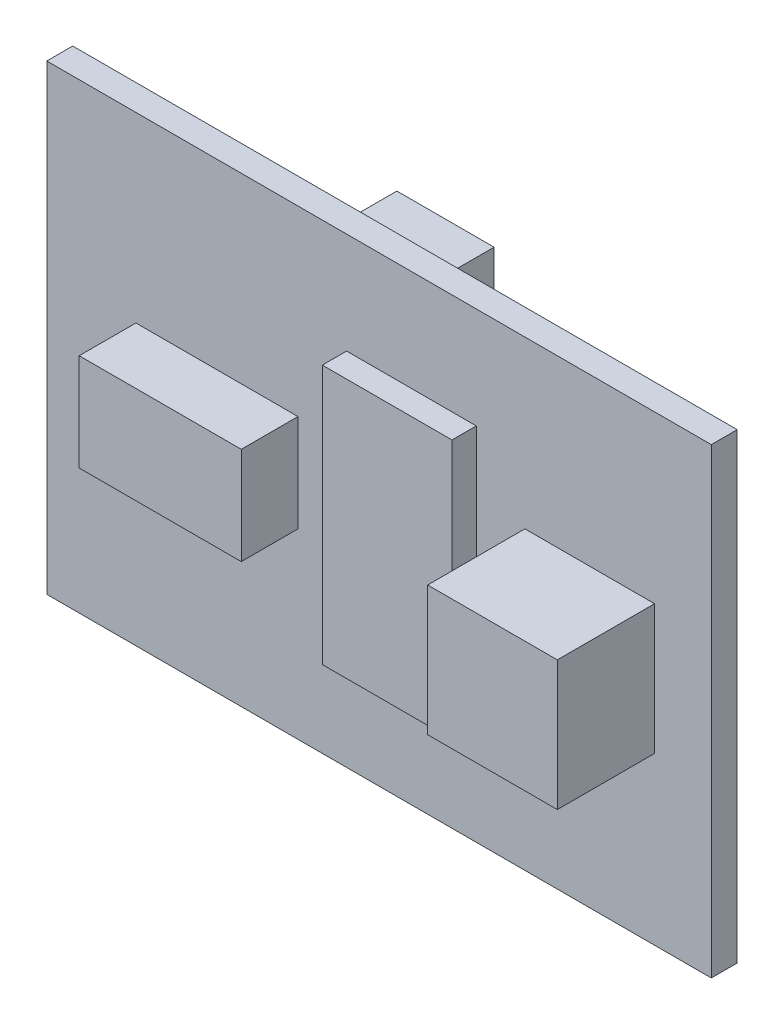
ISO-10303-21;
HEADER;
FILE_DESCRIPTION(('STEP AP214'),'2;1');
FILE_NAME('part.step','',(''),(''),'','','');
FILE_SCHEMA(('AUTOMOTIVE_DESIGN { 1 0 10303 214 1 1 1 1 }'));
ENDSEC;
DATA;
#1=APPLICATION_CONTEXT('core data for automotive mechanical design processes');
#2=APPLICATION_PROTOCOL_DEFINITION('international standard','automotive_design',2000,#1);
#3=PRODUCT_CONTEXT('',#1,'mechanical');
#4=PRODUCT('Part','Part','',(#3));
#5=PRODUCT_RELATED_PRODUCT_CATEGORY('part','',(#4));
#6=PRODUCT_DEFINITION_FORMATION('','',#4);
#7=PRODUCT_DEFINITION_CONTEXT('part definition',#1,'design');
#8=PRODUCT_DEFINITION('design','',#6,#7);
#9=PRODUCT_DEFINITION_SHAPE('','',#8);
#10=(LENGTH_UNIT() NAMED_UNIT(*) SI_UNIT(.MILLI.,.METRE.));
#11=(NAMED_UNIT(*) PLANE_ANGLE_UNIT() SI_UNIT($,.RADIAN.));
#12=(NAMED_UNIT(*) SI_UNIT($,.STERADIAN.) SOLID_ANGLE_UNIT());
#13=UNCERTAINTY_MEASURE_WITH_UNIT(LENGTH_MEASURE(1.E-05),#10,'distance_accuracy_value','');
#14=(GEOMETRIC_REPRESENTATION_CONTEXT(3) GLOBAL_UNCERTAINTY_ASSIGNED_CONTEXT((#13)) GLOBAL_UNIT_ASSIGNED_CONTEXT((#10,
#11,#12)) REPRESENTATION_CONTEXT('',''));
#15=CARTESIAN_POINT('',(0.,0.,0.));
#16=DIRECTION('',(0.,0.,1.));
#17=DIRECTION('',(1.,0.,0.));
#18=AXIS2_PLACEMENT_3D('',#15,#16,#17);
#19=CARTESIAN_POINT('',(0.,0.,14.7));
#20=DIRECTION('',(0.,0.,-1.));
#21=DIRECTION('',(-1.,0.,0.));
#22=AXIS2_PLACEMENT_3D('',#19,#20,#21);
#23=PLANE('',#22);
#24=DIRECTION('',(0.,1.,0.));
#25=VECTOR('',#24,1.);
#26=CARTESIAN_POINT('',(-15.,0.5,14.7));
#27=LINE('',#26,#25);
#28=CARTESIAN_POINT('',(-15.,0.5,14.7));
#29=VERTEX_POINT('',#28);
#30=CARTESIAN_POINT('',(-15.,6.5,14.7));
#31=VERTEX_POINT('',#30);
#32=EDGE_CURVE('E197',#29,#31,#27,.T.);
#33=ORIENTED_EDGE('',*,*,#32,.F.);
#34=DIRECTION('',(1.,0.,0.));
#35=VECTOR('',#34,1.);
#36=CARTESIAN_POINT('',(-25.,0.5,14.7));
#37=LINE('',#36,#35);
#38=CARTESIAN_POINT('',(-25.,0.5,14.7));
#39=VERTEX_POINT('',#38);
#40=EDGE_CURVE('E210',#39,#29,#37,.T.);
#41=ORIENTED_EDGE('',*,*,#40,.F.);
#42=DIRECTION('',(0.,-1.,0.));
#43=VECTOR('',#42,1.);
#44=CARTESIAN_POINT('',(-25.,0.5,14.7));
#45=LINE('',#44,#43);
#46=CARTESIAN_POINT('',(-25.,6.5,14.7));
#47=VERTEX_POINT('',#46);
#48=EDGE_CURVE('E219',#47,#39,#45,.T.);
#49=ORIENTED_EDGE('',*,*,#48,.F.);
#50=DIRECTION('',(-1.,0.,0.));
#51=VECTOR('',#50,1.);
#52=CARTESIAN_POINT('',(-25.,6.5,14.7));
#53=LINE('',#52,#51);
#54=EDGE_CURVE('E200',#31,#47,#53,.T.);
#55=ORIENTED_EDGE('',*,*,#54,.F.);
#56=EDGE_LOOP('',(#33,#41,#49,#55));
#57=FACE_BOUND('',#56,.T.);
#58=DIRECTION('',(0.,1.,0.));
#59=VECTOR('',#58,1.);
#60=CARTESIAN_POINT('',(10.5,-10.75,14.7));
#61=LINE('',#60,#59);
#62=CARTESIAN_POINT('',(10.5,-10.75,14.7));
#63=VERTEX_POINT('',#62);
#64=CARTESIAN_POINT('',(10.5,17.75,14.7));
#65=VERTEX_POINT('',#64);
#66=EDGE_CURVE('E302',#63,#65,#61,.T.);
#67=ORIENTED_EDGE('',*,*,#66,.T.);
#68=DIRECTION('',(-1.,0.,0.));
#69=VECTOR('',#68,1.);
#70=CARTESIAN_POINT('',(-30.5,17.75,14.7));
#71=LINE('',#70,#69);
#72=CARTESIAN_POINT('',(-30.5,17.75,14.7));
#73=VERTEX_POINT('',#72);
#74=EDGE_CURVE('E305',#65,#73,#71,.T.);
#75=ORIENTED_EDGE('',*,*,#74,.T.);
#76=DIRECTION('',(0.,-1.,0.));
#77=VECTOR('',#76,1.);
#78=CARTESIAN_POINT('',(-30.5,-10.75,14.7));
#79=LINE('',#78,#77);
#80=CARTESIAN_POINT('',(-30.5,-10.75,14.7));
#81=VERTEX_POINT('',#80);
#82=EDGE_CURVE('E308',#73,#81,#79,.T.);
#83=ORIENTED_EDGE('',*,*,#82,.T.);
#84=DIRECTION('',(1.,0.,0.));
#85=VECTOR('',#84,1.);
#86=CARTESIAN_POINT('',(-30.5,-10.75,14.7));
#87=LINE('',#86,#85);
#88=EDGE_CURVE('E310',#81,#63,#87,.T.);
#89=ORIENTED_EDGE('',*,*,#88,.T.);
#90=EDGE_LOOP('',(#67,#75,#83,#89));
#91=FACE_BOUND('',#90,.T.);
#92=DIRECTION('',(0.,1.,0.));
#93=VECTOR('',#92,1.);
#94=CARTESIAN_POINT('',(7.,-0.5,14.7));
#95=LINE('',#94,#93);
#96=CARTESIAN_POINT('',(7.,-0.5,14.7));
#97=VERTEX_POINT('',#96);
#98=CARTESIAN_POINT('',(7.,7.5,14.7));
#99=VERTEX_POINT('',#98);
#100=EDGE_CURVE('E235',#97,#99,#95,.T.);
#101=ORIENTED_EDGE('',*,*,#100,.F.);
#102=DIRECTION('',(1.,0.,0.));
#103=VECTOR('',#102,1.);
#104=CARTESIAN_POINT('',(-1.,-0.5,14.7));
#105=LINE('',#104,#103);
#106=CARTESIAN_POINT('',(-1.,-0.5,14.7));
#107=VERTEX_POINT('',#106);
#108=EDGE_CURVE('E240',#107,#97,#105,.T.);
#109=ORIENTED_EDGE('',*,*,#108,.F.);
#110=DIRECTION('',(0.,-1.,0.));
#111=VECTOR('',#110,1.);
#112=CARTESIAN_POINT('',(-1.,-0.5,14.7));
#113=LINE('',#112,#111);
#114=CARTESIAN_POINT('',(-1.,7.5,14.7));
#115=VERTEX_POINT('',#114);
#116=EDGE_CURVE('E252',#115,#107,#113,.T.);
#117=ORIENTED_EDGE('',*,*,#116,.F.);
#118=DIRECTION('',(-1.,0.,0.));
#119=VECTOR('',#118,1.);
#120=CARTESIAN_POINT('',(-1.,7.5,14.7));
#121=LINE('',#120,#119);
#122=EDGE_CURVE('E249',#99,#115,#121,.T.);
#123=ORIENTED_EDGE('',*,*,#122,.F.);
#124=EDGE_LOOP('',(#101,#109,#117,#123));
#125=FACE_BOUND('',#124,.T.);
#126=DIRECTION('',(0.,1.,0.));
#127=VECTOR('',#126,1.);
#128=CARTESIAN_POINT('',(-4.,-4.5,14.7));
#129=LINE('',#128,#127);
#130=CARTESIAN_POINT('',(-4.,-4.5,14.7));
#131=VERTEX_POINT('',#130);
#132=CARTESIAN_POINT('',(-4.,11.5,14.7));
#133=VERTEX_POINT('',#132);
#134=EDGE_CURVE('E196',#131,#133,#129,.T.);
#135=ORIENTED_EDGE('',*,*,#134,.F.);
#136=DIRECTION('',(1.,0.,0.));
#137=VECTOR('',#136,1.);
#138=CARTESIAN_POINT('',(-12.,-4.5,14.7));
#139=LINE('',#138,#137);
#140=CARTESIAN_POINT('',(-12.,-4.5,14.7));
#141=VERTEX_POINT('',#140);
#142=EDGE_CURVE('E193',#141,#131,#139,.T.);
#143=ORIENTED_EDGE('',*,*,#142,.F.);
#144=DIRECTION('',(0.,-1.,0.));
#145=VECTOR('',#144,1.);
#146=CARTESIAN_POINT('',(-12.,-4.5,14.7));
#147=LINE('',#146,#145);
#148=CARTESIAN_POINT('',(-12.,11.5,14.7));
#149=VERTEX_POINT('',#148);
#150=EDGE_CURVE('E59',#149,#141,#147,.T.);
#151=ORIENTED_EDGE('',*,*,#150,.F.);
#152=DIRECTION('',(-1.,0.,0.));
#153=VECTOR('',#152,1.);
#154=CARTESIAN_POINT('',(-12.,11.5,14.7));
#155=LINE('',#154,#153);
#156=EDGE_CURVE('E54',#133,#149,#155,.T.);
#157=ORIENTED_EDGE('',*,*,#156,.F.);
#158=EDGE_LOOP('',(#135,#143,#151,#157));
#159=FACE_BOUND('',#158,.T.);
#160=ADVANCED_FACE('F39',(#57,#91,#125,#159),#23,.F.);
#161=CARTESIAN_POINT('',(0.,0.,13.1));
#162=DIRECTION('',(0.,0.,-1.));
#163=DIRECTION('',(-1.,0.,0.));
#164=AXIS2_PLACEMENT_3D('',#161,#162,#163);
#165=PLANE('',#164);
#166=DIRECTION('',(0.,1.,0.));
#167=VECTOR('',#166,1.);
#168=CARTESIAN_POINT('',(10.5,-10.75,13.1));
#169=LINE('',#168,#167);
#170=CARTESIAN_POINT('',(10.5,-10.75,13.1));
#171=VERTEX_POINT('',#170);
#172=CARTESIAN_POINT('',(10.5,17.75,13.1));
#173=VERTEX_POINT('',#172);
#174=EDGE_CURVE('E301',#171,#173,#169,.T.);
#175=ORIENTED_EDGE('',*,*,#174,.F.);
#176=DIRECTION('',(1.,0.,0.));
#177=VECTOR('',#176,1.);
#178=CARTESIAN_POINT('',(-30.5,-10.75,13.1));
#179=LINE('',#178,#177);
#180=CARTESIAN_POINT('',(-30.5,-10.75,13.1));
#181=VERTEX_POINT('',#180);
#182=EDGE_CURVE('E306',#181,#171,#179,.T.);
#183=ORIENTED_EDGE('',*,*,#182,.F.);
#184=DIRECTION('',(0.,-1.,0.));
#185=VECTOR('',#184,1.);
#186=CARTESIAN_POINT('',(-30.5,-10.75,13.1));
#187=LINE('',#186,#185);
#188=CARTESIAN_POINT('',(-30.5,17.75,13.1));
#189=VERTEX_POINT('',#188);
#190=EDGE_CURVE('E317',#189,#181,#187,.T.);
#191=ORIENTED_EDGE('',*,*,#190,.F.);
#192=DIRECTION('',(-1.,0.,0.));
#193=VECTOR('',#192,1.);
#194=CARTESIAN_POINT('',(-30.5,17.75,13.1));
#195=LINE('',#194,#193);
#196=EDGE_CURVE('E315',#173,#189,#195,.T.);
#197=ORIENTED_EDGE('',*,*,#196,.F.);
#198=EDGE_LOOP('',(#175,#183,#191,#197));
#199=FACE_BOUND('',#198,.T.);
#200=DIRECTION('',(1.,0.,0.));
#201=VECTOR('',#200,1.);
#202=CARTESIAN_POINT('',(-13.,-10.5,13.1));
#203=LINE('',#202,#201);
#204=CARTESIAN_POINT('',(-13.,-10.5,13.1));
#205=VERTEX_POINT('',#204);
#206=CARTESIAN_POINT('',(-7.,-10.5,13.1));
#207=VERTEX_POINT('',#206);
#208=EDGE_CURVE('E279',#205,#207,#203,.T.);
#209=ORIENTED_EDGE('',*,*,#208,.T.);
#210=DIRECTION('',(0.,1.,0.));
#211=VECTOR('',#210,1.);
#212=CARTESIAN_POINT('',(-7.,-10.5,13.1));
#213=LINE('',#212,#211);
#214=CARTESIAN_POINT('',(-7.,17.5,13.1));
#215=VERTEX_POINT('',#214);
#216=EDGE_CURVE('E269',#207,#215,#213,.T.);
#217=ORIENTED_EDGE('',*,*,#216,.T.);
#218=DIRECTION('',(-1.,0.,0.));
#219=VECTOR('',#218,1.);
#220=CARTESIAN_POINT('',(-13.,17.5,13.1));
#221=LINE('',#220,#219);
#222=CARTESIAN_POINT('',(-13.,17.5,13.1));
#223=VERTEX_POINT('',#222);
#224=EDGE_CURVE('E272',#215,#223,#221,.T.);
#225=ORIENTED_EDGE('',*,*,#224,.T.);
#226=DIRECTION('',(0.,-1.,0.));
#227=VECTOR('',#226,1.);
#228=CARTESIAN_POINT('',(-13.,-10.5,13.1));
#229=LINE('',#228,#227);
#230=EDGE_CURVE('E276',#223,#205,#229,.T.);
#231=ORIENTED_EDGE('',*,*,#230,.T.);
#232=EDGE_LOOP('',(#209,#217,#225,#231));
#233=FACE_BOUND('',#232,.T.);
#234=ADVANCED_FACE('F335',(#199,#233),#165,.T.);
#235=CARTESIAN_POINT('',(10.5,-10.75,14.7));
#236=DIRECTION('',(-1.,0.,0.));
#237=DIRECTION('',(0.,0.,1.));
#238=AXIS2_PLACEMENT_3D('',#235,#236,#237);
#239=PLANE('',#238);
#240=ORIENTED_EDGE('',*,*,#174,.T.);
#241=DIRECTION('',(0.,0.,-1.));
#242=VECTOR('',#241,1.);
#243=CARTESIAN_POINT('',(10.5,17.75,14.7));
#244=LINE('',#243,#242);
#245=EDGE_CURVE('E11',#65,#173,#244,.T.);
#246=ORIENTED_EDGE('',*,*,#245,.F.);
#247=ORIENTED_EDGE('',*,*,#66,.F.);
#248=DIRECTION('',(0.,0.,-1.));
#249=VECTOR('',#248,1.);
#250=CARTESIAN_POINT('',(10.5,-10.75,14.7));
#251=LINE('',#250,#249);
#252=EDGE_CURVE('E312',#63,#171,#251,.T.);
#253=ORIENTED_EDGE('',*,*,#252,.T.);
#254=EDGE_LOOP('',(#240,#246,#247,#253));
#255=FACE_BOUND('',#254,.T.);
#256=ADVANCED_FACE('F41',(#255),#239,.F.);
#257=CARTESIAN_POINT('',(-30.5,17.75,14.7));
#258=DIRECTION('',(0.,-1.,0.));
#259=DIRECTION('',(0.,0.,-1.));
#260=AXIS2_PLACEMENT_3D('',#257,#258,#259);
#261=PLANE('',#260);
#262=ORIENTED_EDGE('',*,*,#196,.T.);
#263=DIRECTION('',(0.,0.,-1.));
#264=VECTOR('',#263,1.);
#265=CARTESIAN_POINT('',(-30.5,17.75,14.7));
#266=LINE('',#265,#264);
#267=EDGE_CURVE('E47',#73,#189,#266,.T.);
#268=ORIENTED_EDGE('',*,*,#267,.F.);
#269=ORIENTED_EDGE('',*,*,#74,.F.);
#270=ORIENTED_EDGE('',*,*,#245,.T.);
#271=EDGE_LOOP('',(#262,#268,#269,#270));
#272=FACE_BOUND('',#271,.T.);
#273=ADVANCED_FACE('F346',(#272),#261,.F.);
#274=CARTESIAN_POINT('',(-30.5,-10.75,14.7));
#275=DIRECTION('',(1.,0.,0.));
#276=DIRECTION('',(0.,0.,-1.));
#277=AXIS2_PLACEMENT_3D('',#274,#275,#276);
#278=PLANE('',#277);
#279=ORIENTED_EDGE('',*,*,#190,.T.);
#280=DIRECTION('',(0.,0.,-1.));
#281=VECTOR('',#280,1.);
#282=CARTESIAN_POINT('',(-30.5,-10.75,14.7));
#283=LINE('',#282,#281);
#284=EDGE_CURVE('E322',#81,#181,#283,.T.);
#285=ORIENTED_EDGE('',*,*,#284,.F.);
#286=ORIENTED_EDGE('',*,*,#82,.F.);
#287=ORIENTED_EDGE('',*,*,#267,.T.);
#288=EDGE_LOOP('',(#279,#285,#286,#287));
#289=FACE_BOUND('',#288,.T.);
#290=ADVANCED_FACE('F329',(#289),#278,.F.);
#291=CARTESIAN_POINT('',(-30.5,-10.75,14.7));
#292=DIRECTION('',(0.,1.,0.));
#293=DIRECTION('',(0.,0.,1.));
#294=AXIS2_PLACEMENT_3D('',#291,#292,#293);
#295=PLANE('',#294);
#296=ORIENTED_EDGE('',*,*,#182,.T.);
#297=ORIENTED_EDGE('',*,*,#252,.F.);
#298=ORIENTED_EDGE('',*,*,#88,.F.);
#299=ORIENTED_EDGE('',*,*,#284,.T.);
#300=EDGE_LOOP('',(#296,#297,#298,#299));
#301=FACE_BOUND('',#300,.T.);
#302=ADVANCED_FACE('F339',(#301),#295,.F.);
#303=CARTESIAN_POINT('',(-7.,-10.5,13.1));
#304=DIRECTION('',(-1.,0.,0.));
#305=DIRECTION('',(0.,0.,1.));
#306=AXIS2_PLACEMENT_3D('',#303,#304,#305);
#307=PLANE('',#306);
#308=DIRECTION('',(0.,1.,0.));
#309=VECTOR('',#308,1.);
#310=CARTESIAN_POINT('',(-7.,-10.5,10.6));
#311=LINE('',#310,#309);
#312=CARTESIAN_POINT('',(-7.,-10.5,10.6));
#313=VERTEX_POINT('',#312);
#314=CARTESIAN_POINT('',(-7.,17.5,10.6));
#315=VERTEX_POINT('',#314);
#316=EDGE_CURVE('E268',#313,#315,#311,.T.);
#317=ORIENTED_EDGE('',*,*,#316,.T.);
#318=DIRECTION('',(0.,0.,-1.));
#319=VECTOR('',#318,1.);
#320=CARTESIAN_POINT('',(-7.,17.5,13.1));
#321=LINE('',#320,#319);
#322=EDGE_CURVE('E298',#215,#315,#321,.T.);
#323=ORIENTED_EDGE('',*,*,#322,.F.);
#324=ORIENTED_EDGE('',*,*,#216,.F.);
#325=DIRECTION('',(0.,0.,-1.));
#326=VECTOR('',#325,1.);
#327=CARTESIAN_POINT('',(-7.,-10.5,13.1));
#328=LINE('',#327,#326);
#329=EDGE_CURVE('E282',#207,#313,#328,.T.);
#330=ORIENTED_EDGE('',*,*,#329,.T.);
#331=EDGE_LOOP('',(#317,#323,#324,#330));
#332=FACE_BOUND('',#331,.T.);
#333=ADVANCED_FACE('F361',(#332),#307,.F.);
#334=CARTESIAN_POINT('',(-13.,17.5,13.1));
#335=DIRECTION('',(0.,-1.,0.));
#336=DIRECTION('',(0.,0.,-1.));
#337=AXIS2_PLACEMENT_3D('',#334,#335,#336);
#338=PLANE('',#337);
#339=DIRECTION('',(-1.,0.,0.));
#340=VECTOR('',#339,1.);
#341=CARTESIAN_POINT('',(-13.,17.5,10.6));
#342=LINE('',#341,#340);
#343=CARTESIAN_POINT('',(-13.,17.5,10.6));
#344=VERTEX_POINT('',#343);
#345=EDGE_CURVE('E285',#315,#344,#342,.T.);
#346=ORIENTED_EDGE('',*,*,#345,.T.);
#347=DIRECTION('',(0.,0.,-1.));
#348=VECTOR('',#347,1.);
#349=CARTESIAN_POINT('',(-13.,17.5,13.1));
#350=LINE('',#349,#348);
#351=EDGE_CURVE('E295',#223,#344,#350,.T.);
#352=ORIENTED_EDGE('',*,*,#351,.F.);
#353=ORIENTED_EDGE('',*,*,#224,.F.);
#354=ORIENTED_EDGE('',*,*,#322,.T.);
#355=EDGE_LOOP('',(#346,#352,#353,#354));
#356=FACE_BOUND('',#355,.T.);
#357=ADVANCED_FACE('F368',(#356),#338,.F.);
#358=CARTESIAN_POINT('',(-13.,-10.5,13.1));
#359=DIRECTION('',(1.,0.,0.));
#360=DIRECTION('',(0.,0.,-1.));
#361=AXIS2_PLACEMENT_3D('',#358,#359,#360);
#362=PLANE('',#361);
#363=DIRECTION('',(0.,-1.,0.));
#364=VECTOR('',#363,1.);
#365=CARTESIAN_POINT('',(-13.,-10.5,10.6));
#366=LINE('',#365,#364);
#367=CARTESIAN_POINT('',(-13.,-10.5,10.6));
#368=VERTEX_POINT('',#367);
#369=EDGE_CURVE('E287',#344,#368,#366,.T.);
#370=ORIENTED_EDGE('',*,*,#369,.T.);
#371=DIRECTION('',(0.,0.,-1.));
#372=VECTOR('',#371,1.);
#373=CARTESIAN_POINT('',(-13.,-10.5,13.1));
#374=LINE('',#373,#372);
#375=EDGE_CURVE('E292',#205,#368,#374,.T.);
#376=ORIENTED_EDGE('',*,*,#375,.F.);
#377=ORIENTED_EDGE('',*,*,#230,.F.);
#378=ORIENTED_EDGE('',*,*,#351,.T.);
#379=EDGE_LOOP('',(#370,#376,#377,#378));
#380=FACE_BOUND('',#379,.T.);
#381=ADVANCED_FACE('F373',(#380),#362,.F.);
#382=CARTESIAN_POINT('',(-13.,-10.5,13.1));
#383=DIRECTION('',(0.,1.,0.));
#384=DIRECTION('',(0.,0.,1.));
#385=AXIS2_PLACEMENT_3D('',#382,#383,#384);
#386=PLANE('',#385);
#387=DIRECTION('',(1.,0.,0.));
#388=VECTOR('',#387,1.);
#389=CARTESIAN_POINT('',(-13.,-10.5,10.6));
#390=LINE('',#389,#388);
#391=EDGE_CURVE('E273',#368,#313,#390,.T.);
#392=ORIENTED_EDGE('',*,*,#391,.T.);
#393=ORIENTED_EDGE('',*,*,#329,.F.);
#394=ORIENTED_EDGE('',*,*,#208,.F.);
#395=ORIENTED_EDGE('',*,*,#375,.T.);
#396=EDGE_LOOP('',(#392,#393,#394,#395));
#397=FACE_BOUND('',#396,.T.);
#398=ADVANCED_FACE('F385',(#397),#386,.F.);
#399=CARTESIAN_POINT('',(0.,0.,10.6));
#400=DIRECTION('',(0.,0.,-1.));
#401=DIRECTION('',(-1.,0.,0.));
#402=AXIS2_PLACEMENT_3D('',#399,#400,#401);
#403=PLANE('',#402);
#404=ORIENTED_EDGE('',*,*,#316,.F.);
#405=ORIENTED_EDGE('',*,*,#391,.F.);
#406=ORIENTED_EDGE('',*,*,#369,.F.);
#407=ORIENTED_EDGE('',*,*,#345,.F.);
#408=EDGE_LOOP('',(#404,#405,#406,#407));
#409=FACE_BOUND('',#408,.T.);
#410=ADVANCED_FACE('F380',(#409),#403,.T.);
#411=CARTESIAN_POINT('',(7.,-0.5,20.7));
#412=DIRECTION('',(-1.,0.,0.));
#413=DIRECTION('',(0.,0.,1.));
#414=AXIS2_PLACEMENT_3D('',#411,#412,#413);
#415=PLANE('',#414);
#416=ORIENTED_EDGE('',*,*,#100,.T.);
#417=DIRECTION('',(0.,0.,-1.));
#418=VECTOR('',#417,1.);
#419=CARTESIAN_POINT('',(7.,7.5,20.7));
#420=LINE('',#419,#418);
#421=CARTESIAN_POINT('',(7.,7.5,20.7));
#422=VERTEX_POINT('',#421);
#423=EDGE_CURVE('E265',#422,#99,#420,.T.);
#424=ORIENTED_EDGE('',*,*,#423,.F.);
#425=DIRECTION('',(0.,1.,0.));
#426=VECTOR('',#425,1.);
#427=CARTESIAN_POINT('',(7.,-0.5,20.7));
#428=LINE('',#427,#426);
#429=CARTESIAN_POINT('',(7.,-0.5,20.7));
#430=VERTEX_POINT('',#429);
#431=EDGE_CURVE('E236',#430,#422,#428,.T.);
#432=ORIENTED_EDGE('',*,*,#431,.F.);
#433=DIRECTION('',(0.,0.,-1.));
#434=VECTOR('',#433,1.);
#435=CARTESIAN_POINT('',(7.,-0.5,20.7));
#436=LINE('',#435,#434);
#437=EDGE_CURVE('E246',#430,#97,#436,.T.);
#438=ORIENTED_EDGE('',*,*,#437,.T.);
#439=EDGE_LOOP('',(#416,#424,#432,#438));
#440=FACE_BOUND('',#439,.T.);
#441=ADVANCED_FACE('F396',(#440),#415,.F.);
#442=CARTESIAN_POINT('',(-1.,7.5,20.7));
#443=DIRECTION('',(0.,-1.,0.));
#444=DIRECTION('',(0.,0.,-1.));
#445=AXIS2_PLACEMENT_3D('',#442,#443,#444);
#446=PLANE('',#445);
#447=ORIENTED_EDGE('',*,*,#122,.T.);
#448=DIRECTION('',(0.,0.,-1.));
#449=VECTOR('',#448,1.);
#450=CARTESIAN_POINT('',(-1.,7.5,20.7));
#451=LINE('',#450,#449);
#452=CARTESIAN_POINT('',(-1.,7.5,20.7));
#453=VERTEX_POINT('',#452);
#454=EDGE_CURVE('E262',#453,#115,#451,.T.);
#455=ORIENTED_EDGE('',*,*,#454,.F.);
#456=DIRECTION('',(-1.,0.,0.));
#457=VECTOR('',#456,1.);
#458=CARTESIAN_POINT('',(-1.,7.5,20.7));
#459=LINE('',#458,#457);
#460=EDGE_CURVE('E239',#422,#453,#459,.T.);
#461=ORIENTED_EDGE('',*,*,#460,.F.);
#462=ORIENTED_EDGE('',*,*,#423,.T.);
#463=EDGE_LOOP('',(#447,#455,#461,#462));
#464=FACE_BOUND('',#463,.T.);
#465=ADVANCED_FACE('F399',(#464),#446,.F.);
#466=CARTESIAN_POINT('',(-1.,-0.5,20.7));
#467=DIRECTION('',(1.,0.,0.));
#468=DIRECTION('',(0.,0.,-1.));
#469=AXIS2_PLACEMENT_3D('',#466,#467,#468);
#470=PLANE('',#469);
#471=ORIENTED_EDGE('',*,*,#116,.T.);
#472=DIRECTION('',(0.,0.,-1.));
#473=VECTOR('',#472,1.);
#474=CARTESIAN_POINT('',(-1.,-0.5,20.7));
#475=LINE('',#474,#473);
#476=CARTESIAN_POINT('',(-1.,-0.5,20.7));
#477=VERTEX_POINT('',#476);
#478=EDGE_CURVE('E259',#477,#107,#475,.T.);
#479=ORIENTED_EDGE('',*,*,#478,.F.);
#480=DIRECTION('',(0.,-1.,0.));
#481=VECTOR('',#480,1.);
#482=CARTESIAN_POINT('',(-1.,-0.5,20.7));
#483=LINE('',#482,#481);
#484=EDGE_CURVE('E242',#453,#477,#483,.T.);
#485=ORIENTED_EDGE('',*,*,#484,.F.);
#486=ORIENTED_EDGE('',*,*,#454,.T.);
#487=EDGE_LOOP('',(#471,#479,#485,#486));
#488=FACE_BOUND('',#487,.T.);
#489=ADVANCED_FACE('F403',(#488),#470,.F.);
#490=CARTESIAN_POINT('',(-1.,-0.5,20.7));
#491=DIRECTION('',(0.,1.,0.));
#492=DIRECTION('',(0.,0.,1.));
#493=AXIS2_PLACEMENT_3D('',#490,#491,#492);
#494=PLANE('',#493);
#495=ORIENTED_EDGE('',*,*,#108,.T.);
#496=ORIENTED_EDGE('',*,*,#437,.F.);
#497=DIRECTION('',(1.,0.,0.));
#498=VECTOR('',#497,1.);
#499=CARTESIAN_POINT('',(-1.,-0.5,20.7));
#500=LINE('',#499,#498);
#501=EDGE_CURVE('E244',#477,#430,#500,.T.);
#502=ORIENTED_EDGE('',*,*,#501,.F.);
#503=ORIENTED_EDGE('',*,*,#478,.T.);
#504=EDGE_LOOP('',(#495,#496,#502,#503));
#505=FACE_BOUND('',#504,.T.);
#506=ADVANCED_FACE('F407',(#505),#494,.F.);
#507=CARTESIAN_POINT('',(0.,0.,20.7));
#508=DIRECTION('',(0.,0.,-1.));
#509=DIRECTION('',(-1.,0.,0.));
#510=AXIS2_PLACEMENT_3D('',#507,#508,#509);
#511=PLANE('',#510);
#512=ORIENTED_EDGE('',*,*,#431,.T.);
#513=ORIENTED_EDGE('',*,*,#460,.T.);
#514=ORIENTED_EDGE('',*,*,#484,.T.);
#515=ORIENTED_EDGE('',*,*,#501,.T.);
#516=EDGE_LOOP('',(#512,#513,#514,#515));
#517=FACE_BOUND('',#516,.T.);
#518=ADVANCED_FACE('F411',(#517),#511,.F.);
#519=CARTESIAN_POINT('',(-15.,0.5,18.2));
#520=DIRECTION('',(-1.,0.,0.));
#521=DIRECTION('',(0.,0.,1.));
#522=AXIS2_PLACEMENT_3D('',#519,#520,#521);
#523=PLANE('',#522);
#524=ORIENTED_EDGE('',*,*,#32,.T.);
#525=DIRECTION('',(0.,0.,-1.));
#526=VECTOR('',#525,1.);
#527=CARTESIAN_POINT('',(-15.,6.5,18.2));
#528=LINE('',#527,#526);
#529=CARTESIAN_POINT('',(-15.,6.5,18.2));
#530=VERTEX_POINT('',#529);
#531=EDGE_CURVE('E232',#530,#31,#528,.T.);
#532=ORIENTED_EDGE('',*,*,#531,.F.);
#533=DIRECTION('',(0.,1.,0.));
#534=VECTOR('',#533,1.);
#535=CARTESIAN_POINT('',(-15.,0.5,18.2));
#536=LINE('',#535,#534);
#537=CARTESIAN_POINT('',(-15.,0.5,18.2));
#538=VERTEX_POINT('',#537);
#539=EDGE_CURVE('E206',#538,#530,#536,.T.);
#540=ORIENTED_EDGE('',*,*,#539,.F.);
#541=DIRECTION('',(0.,0.,-1.));
#542=VECTOR('',#541,1.);
#543=CARTESIAN_POINT('',(-15.,0.5,18.2));
#544=LINE('',#543,#542);
#545=EDGE_CURVE('E215',#538,#29,#544,.T.);
#546=ORIENTED_EDGE('',*,*,#545,.T.);
#547=EDGE_LOOP('',(#524,#532,#540,#546));
#548=FACE_BOUND('',#547,.T.);
#549=ADVANCED_FACE('F415',(#548),#523,.F.);
#550=CARTESIAN_POINT('',(-25.,6.5,18.2));
#551=DIRECTION('',(0.,-1.,0.));
#552=DIRECTION('',(0.,0.,-1.));
#553=AXIS2_PLACEMENT_3D('',#550,#551,#552);
#554=PLANE('',#553);
#555=ORIENTED_EDGE('',*,*,#54,.T.);
#556=DIRECTION('',(0.,0.,-1.));
#557=VECTOR('',#556,1.);
#558=CARTESIAN_POINT('',(-25.,6.5,18.2));
#559=LINE('',#558,#557);
#560=CARTESIAN_POINT('',(-25.,6.5,18.2));
#561=VERTEX_POINT('',#560);
#562=EDGE_CURVE('E229',#561,#47,#559,.T.);
#563=ORIENTED_EDGE('',*,*,#562,.F.);
#564=DIRECTION('',(-1.,0.,0.));
#565=VECTOR('',#564,1.);
#566=CARTESIAN_POINT('',(-25.,6.5,18.2));
#567=LINE('',#566,#565);
#568=EDGE_CURVE('E209',#530,#561,#567,.T.);
#569=ORIENTED_EDGE('',*,*,#568,.F.);
#570=ORIENTED_EDGE('',*,*,#531,.T.);
#571=EDGE_LOOP('',(#555,#563,#569,#570));
#572=FACE_BOUND('',#571,.T.);
#573=ADVANCED_FACE('F419',(#572),#554,.F.);
#574=CARTESIAN_POINT('',(-25.,0.5,18.2));
#575=DIRECTION('',(1.,0.,0.));
#576=DIRECTION('',(0.,0.,-1.));
#577=AXIS2_PLACEMENT_3D('',#574,#575,#576);
#578=PLANE('',#577);
#579=ORIENTED_EDGE('',*,*,#48,.T.);
#580=DIRECTION('',(0.,0.,-1.));
#581=VECTOR('',#580,1.);
#582=CARTESIAN_POINT('',(-25.,0.5,18.2));
#583=LINE('',#582,#581);
#584=CARTESIAN_POINT('',(-25.,0.5,18.2));
#585=VERTEX_POINT('',#584);
#586=EDGE_CURVE('E226',#585,#39,#583,.T.);
#587=ORIENTED_EDGE('',*,*,#586,.F.);
#588=DIRECTION('',(0.,-1.,0.));
#589=VECTOR('',#588,1.);
#590=CARTESIAN_POINT('',(-25.,0.5,18.2));
#591=LINE('',#590,#589);
#592=EDGE_CURVE('E212',#561,#585,#591,.T.);
#593=ORIENTED_EDGE('',*,*,#592,.F.);
#594=ORIENTED_EDGE('',*,*,#562,.T.);
#595=EDGE_LOOP('',(#579,#587,#593,#594));
#596=FACE_BOUND('',#595,.T.);
#597=ADVANCED_FACE('F423',(#596),#578,.F.);
#598=CARTESIAN_POINT('',(-25.,0.5,18.2));
#599=DIRECTION('',(0.,1.,0.));
#600=DIRECTION('',(0.,0.,1.));
#601=AXIS2_PLACEMENT_3D('',#598,#599,#600);
#602=PLANE('',#601);
#603=ORIENTED_EDGE('',*,*,#40,.T.);
#604=ORIENTED_EDGE('',*,*,#545,.F.);
#605=DIRECTION('',(1.,0.,0.));
#606=VECTOR('',#605,1.);
#607=CARTESIAN_POINT('',(-25.,0.5,18.2));
#608=LINE('',#607,#606);
#609=EDGE_CURVE('E214',#585,#538,#608,.T.);
#610=ORIENTED_EDGE('',*,*,#609,.F.);
#611=ORIENTED_EDGE('',*,*,#586,.T.);
#612=EDGE_LOOP('',(#603,#604,#610,#611));
#613=FACE_BOUND('',#612,.T.);
#614=ADVANCED_FACE('F427',(#613),#602,.F.);
#615=CARTESIAN_POINT('',(0.,0.,18.2));
#616=DIRECTION('',(0.,0.,-1.));
#617=DIRECTION('',(-1.,0.,0.));
#618=AXIS2_PLACEMENT_3D('',#615,#616,#617);
#619=PLANE('',#618);
#620=ORIENTED_EDGE('',*,*,#539,.T.);
#621=ORIENTED_EDGE('',*,*,#568,.T.);
#622=ORIENTED_EDGE('',*,*,#592,.T.);
#623=ORIENTED_EDGE('',*,*,#609,.T.);
#624=EDGE_LOOP('',(#620,#621,#622,#623));
#625=FACE_BOUND('',#624,.T.);
#626=ADVANCED_FACE('F431',(#625),#619,.F.);
#627=CARTESIAN_POINT('',(-4.,-4.5,16.2));
#628=DIRECTION('',(-1.,0.,0.));
#629=DIRECTION('',(0.,0.,1.));
#630=AXIS2_PLACEMENT_3D('',#627,#628,#629);
#631=PLANE('',#630);
#632=ORIENTED_EDGE('',*,*,#134,.T.);
#633=DIRECTION('',(0.,0.,-1.));
#634=VECTOR('',#633,1.);
#635=CARTESIAN_POINT('',(-4.,11.5,16.2));
#636=LINE('',#635,#634);
#637=CARTESIAN_POINT('',(-4.,11.5,16.2));
#638=VERTEX_POINT('',#637);
#639=EDGE_CURVE('E177',#638,#133,#636,.T.);
#640=ORIENTED_EDGE('',*,*,#639,.F.);
#641=DIRECTION('',(0.,1.,0.));
#642=VECTOR('',#641,1.);
#643=CARTESIAN_POINT('',(-4.,-4.5,16.2));
#644=LINE('',#643,#642);
#645=CARTESIAN_POINT('',(-4.,-4.5,16.2));
#646=VERTEX_POINT('',#645);
#647=EDGE_CURVE('E184',#646,#638,#644,.T.);
#648=ORIENTED_EDGE('',*,*,#647,.F.);
#649=DIRECTION('',(0.,0.,-1.));
#650=VECTOR('',#649,1.);
#651=CARTESIAN_POINT('',(-4.,-4.5,16.2));
#652=LINE('',#651,#650);
#653=EDGE_CURVE('E701',#646,#131,#652,.T.);
#654=ORIENTED_EDGE('',*,*,#653,.T.);
#655=EDGE_LOOP('',(#632,#640,#648,#654));
#656=FACE_BOUND('',#655,.T.);
#657=ADVANCED_FACE('F195',(#656),#631,.F.);
#658=CARTESIAN_POINT('',(-12.,11.5,16.2));
#659=DIRECTION('',(0.,-1.,0.));
#660=DIRECTION('',(0.,0.,-1.));
#661=AXIS2_PLACEMENT_3D('',#658,#659,#660);
#662=PLANE('',#661);
#663=ORIENTED_EDGE('',*,*,#156,.T.);
#664=DIRECTION('',(0.,0.,-1.));
#665=VECTOR('',#664,1.);
#666=CARTESIAN_POINT('',(-12.,11.5,16.2));
#667=LINE('',#666,#665);
#668=CARTESIAN_POINT('',(-12.,11.5,16.2));
#669=VERTEX_POINT('',#668);
#670=EDGE_CURVE('E180',#669,#149,#667,.T.);
#671=ORIENTED_EDGE('',*,*,#670,.F.);
#672=DIRECTION('',(-1.,0.,0.));
#673=VECTOR('',#672,1.);
#674=CARTESIAN_POINT('',(-12.,11.5,16.2));
#675=LINE('',#674,#673);
#676=EDGE_CURVE('E173',#638,#669,#675,.T.);
#677=ORIENTED_EDGE('',*,*,#676,.F.);
#678=ORIENTED_EDGE('',*,*,#639,.T.);
#679=EDGE_LOOP('',(#663,#671,#677,#678));
#680=FACE_BOUND('',#679,.T.);
#681=ADVANCED_FACE('F175',(#680),#662,.F.);
#682=CARTESIAN_POINT('',(-12.,-4.5,16.2));
#683=DIRECTION('',(1.,0.,0.));
#684=DIRECTION('',(0.,0.,-1.));
#685=AXIS2_PLACEMENT_3D('',#682,#683,#684);
#686=PLANE('',#685);
#687=ORIENTED_EDGE('',*,*,#150,.T.);
#688=DIRECTION('',(0.,0.,-1.));
#689=VECTOR('',#688,1.);
#690=CARTESIAN_POINT('',(-12.,-4.5,16.2));
#691=LINE('',#690,#689);
#692=CARTESIAN_POINT('',(-12.,-4.5,16.2));
#693=VERTEX_POINT('',#692);
#694=EDGE_CURVE('E202',#693,#141,#691,.T.);
#695=ORIENTED_EDGE('',*,*,#694,.F.);
#696=DIRECTION('',(0.,-1.,0.));
#697=VECTOR('',#696,1.);
#698=CARTESIAN_POINT('',(-12.,-4.5,16.2));
#699=LINE('',#698,#697);
#700=EDGE_CURVE('E183',#669,#693,#699,.T.);
#701=ORIENTED_EDGE('',*,*,#700,.F.);
#702=ORIENTED_EDGE('',*,*,#670,.T.);
#703=EDGE_LOOP('',(#687,#695,#701,#702));
#704=FACE_BOUND('',#703,.T.);
#705=ADVANCED_FACE('F440',(#704),#686,.F.);
#706=CARTESIAN_POINT('',(-12.,-4.5,16.2));
#707=DIRECTION('',(0.,1.,0.));
#708=DIRECTION('',(0.,0.,1.));
#709=AXIS2_PLACEMENT_3D('',#706,#707,#708);
#710=PLANE('',#709);
#711=ORIENTED_EDGE('',*,*,#142,.T.);
#712=ORIENTED_EDGE('',*,*,#653,.F.);
#713=DIRECTION('',(1.,0.,0.));
#714=VECTOR('',#713,1.);
#715=CARTESIAN_POINT('',(-12.,-4.5,16.2));
#716=LINE('',#715,#714);
#717=EDGE_CURVE('E189',#693,#646,#716,.T.);
#718=ORIENTED_EDGE('',*,*,#717,.F.);
#719=ORIENTED_EDGE('',*,*,#694,.T.);
#720=EDGE_LOOP('',(#711,#712,#718,#719));
#721=FACE_BOUND('',#720,.T.);
#722=ADVANCED_FACE('F443',(#721),#710,.F.);
#723=CARTESIAN_POINT('',(0.,0.,16.2));
#724=DIRECTION('',(0.,0.,-1.));
#725=DIRECTION('',(-1.,0.,0.));
#726=AXIS2_PLACEMENT_3D('',#723,#724,#725);
#727=PLANE('',#726);
#728=ORIENTED_EDGE('',*,*,#647,.T.);
#729=ORIENTED_EDGE('',*,*,#676,.T.);
#730=ORIENTED_EDGE('',*,*,#700,.T.);
#731=ORIENTED_EDGE('',*,*,#717,.T.);
#732=EDGE_LOOP('',(#728,#729,#730,#731));
#733=FACE_BOUND('',#732,.T.);
#734=ADVANCED_FACE('F187',(#733),#727,.F.);
#735=CLOSED_SHELL('',(#160,#234,#256,#273,#290,#302,#333,#357,#381,#398,#410,#441,#465,#489,
#506,#518,#549,#573,#597,#614,#626,#657,#681,#705,#722,#734));
#736=MANIFOLD_SOLID_BREP('B2',#735);
#737=ADVANCED_BREP_SHAPE_REPRESENTATION('',(#18,#736),#14);
#738=SHAPE_DEFINITION_REPRESENTATION(#9,#737);
ENDSEC;
END-ISO-10303-21;
